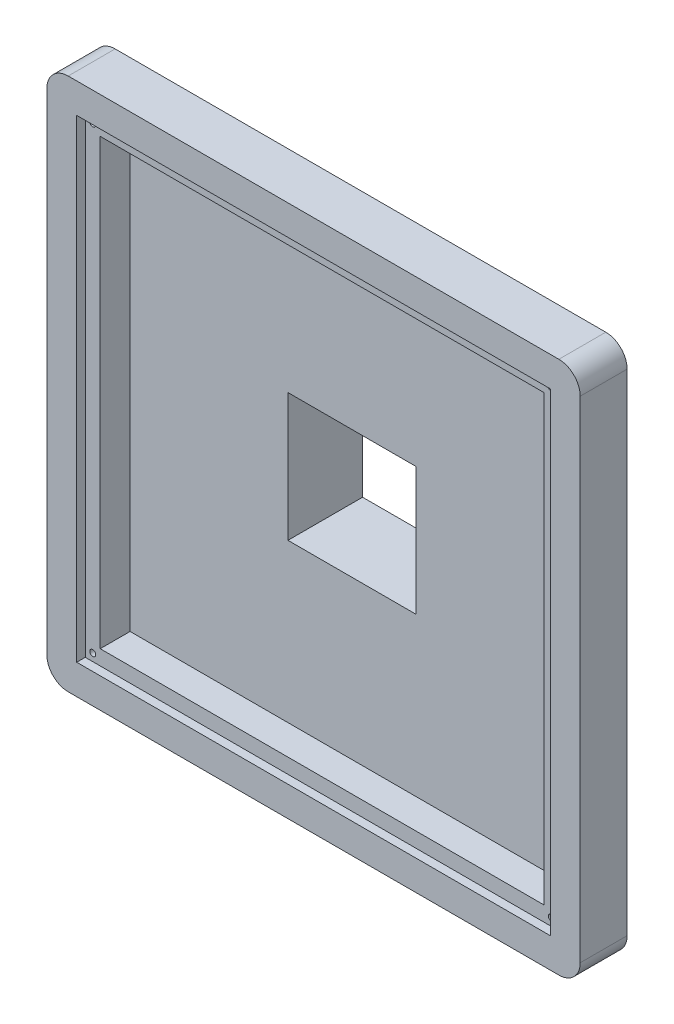
ISO-10303-21;
HEADER;
FILE_DESCRIPTION(('STEP AP214'),'2;1');
FILE_NAME('part.step','',(''),(''),'','','');
FILE_SCHEMA(('AUTOMOTIVE_DESIGN { 1 0 10303 214 1 1 1 1 }'));
ENDSEC;
DATA;
#1=APPLICATION_CONTEXT('core data for automotive mechanical design processes');
#2=APPLICATION_PROTOCOL_DEFINITION('international standard','automotive_design',2000,#1);
#3=PRODUCT_CONTEXT('',#1,'mechanical');
#4=PRODUCT('Part','Part','',(#3));
#5=PRODUCT_RELATED_PRODUCT_CATEGORY('part','',(#4));
#6=PRODUCT_DEFINITION_FORMATION('','',#4);
#7=PRODUCT_DEFINITION_CONTEXT('part definition',#1,'design');
#8=PRODUCT_DEFINITION('design','',#6,#7);
#9=PRODUCT_DEFINITION_SHAPE('','',#8);
#10=(LENGTH_UNIT() NAMED_UNIT(*) SI_UNIT(.MILLI.,.METRE.));
#11=(NAMED_UNIT(*) PLANE_ANGLE_UNIT() SI_UNIT($,.RADIAN.));
#12=(NAMED_UNIT(*) SI_UNIT($,.STERADIAN.) SOLID_ANGLE_UNIT());
#13=UNCERTAINTY_MEASURE_WITH_UNIT(LENGTH_MEASURE(1.E-05),#10,'distance_accuracy_value','');
#14=(GEOMETRIC_REPRESENTATION_CONTEXT(3) GLOBAL_UNCERTAINTY_ASSIGNED_CONTEXT((#13)) GLOBAL_UNIT_ASSIGNED_CONTEXT((#10,
#11,#12)) REPRESENTATION_CONTEXT('',''));
#15=CARTESIAN_POINT('',(0.,0.,0.));
#16=DIRECTION('',(0.,0.,1.));
#17=DIRECTION('',(1.,0.,0.));
#18=AXIS2_PLACEMENT_3D('',#15,#16,#17);
#19=CARTESIAN_POINT('',(0.,0.,21.));
#20=DIRECTION('',(0.,0.,1.));
#21=DIRECTION('',(1.,0.,0.));
#22=AXIS2_PLACEMENT_3D('',#19,#20,#21);
#23=PLANE('',#22);
#24=DIRECTION('',(0.,1.,0.));
#25=VECTOR('',#24,1.);
#26=CARTESIAN_POINT('',(68.2674320619959,-137.574658474626,21.));
#27=LINE('',#26,#25);
#28=CARTESIAN_POINT('',(68.2674320619959,-127.574658474626,21.));
#29=VERTEX_POINT('',#28);
#30=CARTESIAN_POINT('',(68.2674320619959,102.425341525374,21.));
#31=VERTEX_POINT('',#30);
#32=EDGE_CURVE('E350',#29,#31,#27,.T.);
#33=ORIENTED_EDGE('',*,*,#32,.F.);
#34=CARTESIAN_POINT('',(58.2674320619959,-127.574658474626,21.));
#35=DIRECTION('',(0.,0.,1.));
#36=DIRECTION('',(1.,0.,0.));
#37=AXIS2_PLACEMENT_3D('',#34,#35,#36);
#38=CIRCLE('',#37,10.);
#39=CARTESIAN_POINT('',(58.2674320619959,-137.574658474626,21.));
#40=VERTEX_POINT('',#39);
#41=EDGE_CURVE('E396',#29,#40,#38,.F.);
#42=ORIENTED_EDGE('',*,*,#41,.T.);
#43=DIRECTION('',(1.,0.,0.));
#44=VECTOR('',#43,1.);
#45=CARTESIAN_POINT('',(68.2674320619959,-137.574658474626,21.));
#46=LINE('',#45,#44);
#47=CARTESIAN_POINT('',(-171.732567938004,-137.574658474626,21.));
#48=VERTEX_POINT('',#47);
#49=EDGE_CURVE('E347',#48,#40,#46,.T.);
#50=ORIENTED_EDGE('',*,*,#49,.F.);
#51=CARTESIAN_POINT('',(-171.732567938004,-127.574658474626,21.));
#52=DIRECTION('',(0.,0.,1.));
#53=DIRECTION('',(1.,0.,0.));
#54=AXIS2_PLACEMENT_3D('',#51,#52,#53);
#55=CIRCLE('',#54,10.);
#56=CARTESIAN_POINT('',(-181.732567938004,-127.574658474626,21.));
#57=VERTEX_POINT('',#56);
#58=EDGE_CURVE('E376',#48,#57,#55,.F.);
#59=ORIENTED_EDGE('',*,*,#58,.T.);
#60=DIRECTION('',(0.,-1.,0.));
#61=VECTOR('',#60,1.);
#62=CARTESIAN_POINT('',(-181.732567938004,-137.574658474626,21.));
#63=LINE('',#62,#61);
#64=CARTESIAN_POINT('',(-181.732567938004,102.425341525374,21.));
#65=VERTEX_POINT('',#64);
#66=EDGE_CURVE('E344',#65,#57,#63,.T.);
#67=ORIENTED_EDGE('',*,*,#66,.F.);
#68=CARTESIAN_POINT('',(-171.732567938004,102.425341525374,21.));
#69=DIRECTION('',(0.,0.,1.));
#70=DIRECTION('',(1.,0.,0.));
#71=AXIS2_PLACEMENT_3D('',#68,#69,#70);
#72=CIRCLE('',#71,10.);
#73=CARTESIAN_POINT('',(-171.732567938004,112.425341525374,21.));
#74=VERTEX_POINT('',#73);
#75=EDGE_CURVE('E365',#65,#74,#72,.F.);
#76=ORIENTED_EDGE('',*,*,#75,.T.);
#77=DIRECTION('',(-1.,0.,0.));
#78=VECTOR('',#77,1.);
#79=CARTESIAN_POINT('',(68.2674320619959,112.425341525374,21.));
#80=LINE('',#79,#78);
#81=CARTESIAN_POINT('',(58.2674320619959,112.425341525374,21.));
#82=VERTEX_POINT('',#81);
#83=EDGE_CURVE('E352',#82,#74,#80,.T.);
#84=ORIENTED_EDGE('',*,*,#83,.F.);
#85=CARTESIAN_POINT('',(58.2674320619959,102.425341525374,21.));
#86=DIRECTION('',(0.,0.,1.));
#87=DIRECTION('',(1.,0.,0.));
#88=AXIS2_PLACEMENT_3D('',#85,#86,#87);
#89=CIRCLE('',#88,10.);
#90=EDGE_CURVE('E385',#82,#31,#89,.F.);
#91=ORIENTED_EDGE('',*,*,#90,.T.);
#92=EDGE_LOOP('',(#33,#42,#50,#59,#67,#76,#84,#91));
#93=FACE_BOUND('',#92,.T.);
#94=DIRECTION('',(0.,-1.,0.));
#95=VECTOR('',#94,1.);
#96=CARTESIAN_POINT('',(-18.7325679380041,25.425341525374,21.));
#97=LINE('',#96,#95);
#98=CARTESIAN_POINT('',(-18.7325679380041,25.425341525374,21.));
#99=VERTEX_POINT('',#98);
#100=CARTESIAN_POINT('',(-18.7325679380041,-50.574658474626,21.));
#101=VERTEX_POINT('',#100);
#102=EDGE_CURVE('E218',#99,#101,#97,.T.);
#103=ORIENTED_EDGE('',*,*,#102,.F.);
#104=DIRECTION('',(1.,0.,0.));
#105=VECTOR('',#104,1.);
#106=CARTESIAN_POINT('',(-94.7325679380041,25.425341525374,21.));
#107=LINE('',#106,#105);
#108=CARTESIAN_POINT('',(-94.7325679380041,25.425341525374,21.));
#109=VERTEX_POINT('',#108);
#110=EDGE_CURVE('E215',#109,#99,#107,.T.);
#111=ORIENTED_EDGE('',*,*,#110,.F.);
#112=DIRECTION('',(0.,1.,0.));
#113=VECTOR('',#112,1.);
#114=CARTESIAN_POINT('',(-94.7325679380041,25.425341525374,21.));
#115=LINE('',#114,#113);
#116=CARTESIAN_POINT('',(-94.7325679380041,-50.574658474626,21.));
#117=VERTEX_POINT('',#116);
#118=EDGE_CURVE('E58',#117,#109,#115,.T.);
#119=ORIENTED_EDGE('',*,*,#118,.F.);
#120=DIRECTION('',(-1.,0.,0.));
#121=VECTOR('',#120,1.);
#122=CARTESIAN_POINT('',(-94.7325679380041,-50.574658474626,21.));
#123=LINE('',#122,#121);
#124=EDGE_CURVE('E53',#101,#117,#123,.T.);
#125=ORIENTED_EDGE('',*,*,#124,.F.);
#126=EDGE_LOOP('',(#103,#111,#119,#125));
#127=FACE_BOUND('',#126,.T.);
#128=ADVANCED_FACE('F38',(#93,#127),#23,.F.);
#129=CARTESIAN_POINT('',(0.,0.,43.));
#130=DIRECTION('',(0.,0.,1.));
#131=DIRECTION('',(1.,0.,0.));
#132=AXIS2_PLACEMENT_3D('',#129,#130,#131);
#133=PLANE('',#132);
#134=DIRECTION('',(1.,0.,0.));
#135=VECTOR('',#134,1.);
#136=CARTESIAN_POINT('',(68.2674320619959,-137.574658474626,43.));
#137=LINE('',#136,#135);
#138=CARTESIAN_POINT('',(-171.732567938004,-137.574658474626,43.));
#139=VERTEX_POINT('',#138);
#140=CARTESIAN_POINT('',(58.2674320619959,-137.574658474626,43.));
#141=VERTEX_POINT('',#140);
#142=EDGE_CURVE('E325',#139,#141,#137,.T.);
#143=ORIENTED_EDGE('',*,*,#142,.T.);
#144=CARTESIAN_POINT('',(58.2674320619959,-127.574658474626,43.));
#145=DIRECTION('',(0.,0.,1.));
#146=DIRECTION('',(1.,0.,0.));
#147=AXIS2_PLACEMENT_3D('',#144,#145,#146);
#148=CIRCLE('',#147,10.);
#149=CARTESIAN_POINT('',(68.2674320619959,-127.574658474626,43.));
#150=VERTEX_POINT('',#149);
#151=EDGE_CURVE('E11',#141,#150,#148,.T.);
#152=ORIENTED_EDGE('',*,*,#151,.T.);
#153=DIRECTION('',(0.,1.,0.));
#154=VECTOR('',#153,1.);
#155=CARTESIAN_POINT('',(68.2674320619959,-137.574658474626,43.));
#156=LINE('',#155,#154);
#157=CARTESIAN_POINT('',(68.2674320619959,102.425341525374,43.));
#158=VERTEX_POINT('',#157);
#159=EDGE_CURVE('E328',#150,#158,#156,.T.);
#160=ORIENTED_EDGE('',*,*,#159,.T.);
#161=CARTESIAN_POINT('',(58.2674320619959,102.425341525374,43.));
#162=DIRECTION('',(0.,0.,1.));
#163=DIRECTION('',(1.,0.,0.));
#164=AXIS2_PLACEMENT_3D('',#161,#162,#163);
#165=CIRCLE('',#164,10.);
#166=CARTESIAN_POINT('',(58.2674320619959,112.425341525374,43.));
#167=VERTEX_POINT('',#166);
#168=EDGE_CURVE('E391',#158,#167,#165,.T.);
#169=ORIENTED_EDGE('',*,*,#168,.T.);
#170=DIRECTION('',(-1.,0.,0.));
#171=VECTOR('',#170,1.);
#172=CARTESIAN_POINT('',(68.2674320619959,112.425341525374,43.));
#173=LINE('',#172,#171);
#174=CARTESIAN_POINT('',(-171.732567938004,112.425341525374,43.));
#175=VERTEX_POINT('',#174);
#176=EDGE_CURVE('E330',#167,#175,#173,.T.);
#177=ORIENTED_EDGE('',*,*,#176,.T.);
#178=CARTESIAN_POINT('',(-171.732567938004,102.425341525374,43.));
#179=DIRECTION('',(0.,0.,1.));
#180=DIRECTION('',(1.,0.,0.));
#181=AXIS2_PLACEMENT_3D('',#178,#179,#180);
#182=CIRCLE('',#181,10.);
#183=CARTESIAN_POINT('',(-181.732567938004,102.425341525374,43.));
#184=VERTEX_POINT('',#183);
#185=EDGE_CURVE('E371',#175,#184,#182,.T.);
#186=ORIENTED_EDGE('',*,*,#185,.T.);
#187=DIRECTION('',(0.,-1.,0.));
#188=VECTOR('',#187,1.);
#189=CARTESIAN_POINT('',(-181.732567938004,-137.574658474626,43.));
#190=LINE('',#189,#188);
#191=CARTESIAN_POINT('',(-181.732567938004,-127.574658474626,43.));
#192=VERTEX_POINT('',#191);
#193=EDGE_CURVE('E322',#184,#192,#190,.T.);
#194=ORIENTED_EDGE('',*,*,#193,.T.);
#195=CARTESIAN_POINT('',(-171.732567938004,-127.574658474626,43.));
#196=DIRECTION('',(0.,0.,1.));
#197=DIRECTION('',(1.,0.,0.));
#198=AXIS2_PLACEMENT_3D('',#195,#196,#197);
#199=CIRCLE('',#198,10.);
#200=EDGE_CURVE('E380',#192,#139,#199,.T.);
#201=ORIENTED_EDGE('',*,*,#200,.T.);
#202=EDGE_LOOP('',(#143,#152,#160,#169,#177,#186,#194,#201));
#203=FACE_BOUND('',#202,.T.);
#204=DIRECTION('',(0.,1.,0.));
#205=VECTOR('',#204,1.);
#206=CARTESIAN_POINT('',(54.2674320619959,-123.574658474626,43.));
#207=LINE('',#206,#205);
#208=CARTESIAN_POINT('',(54.2674320619959,-123.574658474626,43.));
#209=VERTEX_POINT('',#208);
#210=CARTESIAN_POINT('',(54.2674320619959,98.425341525374,43.));
#211=VERTEX_POINT('',#210);
#212=EDGE_CURVE('E294',#209,#211,#207,.T.);
#213=ORIENTED_EDGE('',*,*,#212,.F.);
#214=DIRECTION('',(-1.,0.,0.));
#215=VECTOR('',#214,1.);
#216=CARTESIAN_POINT('',(54.2674320619959,-123.574658474626,43.));
#217=LINE('',#216,#215);
#218=CARTESIAN_POINT('',(-167.732567938004,-123.574658474626,43.));
#219=VERTEX_POINT('',#218);
#220=EDGE_CURVE('E289',#209,#219,#217,.T.);
#221=ORIENTED_EDGE('',*,*,#220,.T.);
#222=DIRECTION('',(0.,1.,0.));
#223=VECTOR('',#222,1.);
#224=CARTESIAN_POINT('',(-167.732567938004,-123.574658474626,43.));
#225=LINE('',#224,#223);
#226=CARTESIAN_POINT('',(-167.732567938004,98.425341525374,43.));
#227=VERTEX_POINT('',#226);
#228=EDGE_CURVE('E305',#219,#227,#225,.T.);
#229=ORIENTED_EDGE('',*,*,#228,.T.);
#230=DIRECTION('',(-1.,0.,0.));
#231=VECTOR('',#230,1.);
#232=CARTESIAN_POINT('',(54.2674320619959,98.425341525374,43.));
#233=LINE('',#232,#231);
#234=EDGE_CURVE('E308',#211,#227,#233,.T.);
#235=ORIENTED_EDGE('',*,*,#234,.F.);
#236=EDGE_LOOP('',(#213,#221,#229,#235));
#237=FACE_BOUND('',#236,.T.);
#238=ADVANCED_FACE('F406',(#203,#237),#133,.T.);
#239=CARTESIAN_POINT('',(-181.732567938004,-137.574658474626,25.));
#240=DIRECTION('',(1.,0.,0.));
#241=DIRECTION('',(0.,0.,-1.));
#242=AXIS2_PLACEMENT_3D('',#239,#240,#241);
#243=PLANE('',#242);
#244=ORIENTED_EDGE('',*,*,#66,.T.);
#245=DIRECTION('',(0.,0.,-1.));
#246=VECTOR('',#245,1.);
#247=CARTESIAN_POINT('',(-181.732567938004,-127.574658474626,25.));
#248=LINE('',#247,#246);
#249=EDGE_CURVE('E378',#57,#192,#248,.F.);
#250=ORIENTED_EDGE('',*,*,#249,.T.);
#251=ORIENTED_EDGE('',*,*,#193,.F.);
#252=DIRECTION('',(0.,0.,-1.));
#253=VECTOR('',#252,1.);
#254=CARTESIAN_POINT('',(-181.732567938004,102.425341525374,25.));
#255=LINE('',#254,#253);
#256=EDGE_CURVE('E362',#184,#65,#255,.T.);
#257=ORIENTED_EDGE('',*,*,#256,.T.);
#258=EDGE_LOOP('',(#244,#250,#251,#257));
#259=FACE_BOUND('',#258,.T.);
#260=ADVANCED_FACE('F431',(#259),#243,.F.);
#261=CARTESIAN_POINT('',(68.2674320619959,-137.574658474626,25.));
#262=DIRECTION('',(0.,1.,0.));
#263=DIRECTION('',(-1.,0.,0.));
#264=AXIS2_PLACEMENT_3D('',#261,#262,#263);
#265=PLANE('',#264);
#266=ORIENTED_EDGE('',*,*,#49,.T.);
#267=DIRECTION('',(0.,0.,-1.));
#268=VECTOR('',#267,1.);
#269=CARTESIAN_POINT('',(58.2674320619959,-137.574658474626,25.));
#270=LINE('',#269,#268);
#271=EDGE_CURVE('E46',#40,#141,#270,.F.);
#272=ORIENTED_EDGE('',*,*,#271,.T.);
#273=ORIENTED_EDGE('',*,*,#142,.F.);
#274=DIRECTION('',(0.,0.,-1.));
#275=VECTOR('',#274,1.);
#276=CARTESIAN_POINT('',(-171.732567938004,-137.574658474626,25.));
#277=LINE('',#276,#275);
#278=EDGE_CURVE('E373',#139,#48,#277,.T.);
#279=ORIENTED_EDGE('',*,*,#278,.T.);
#280=EDGE_LOOP('',(#266,#272,#273,#279));
#281=FACE_BOUND('',#280,.T.);
#282=ADVANCED_FACE('F400',(#281),#265,.F.);
#283=CARTESIAN_POINT('',(68.2674320619959,-137.574658474626,25.));
#284=DIRECTION('',(-1.,0.,0.));
#285=DIRECTION('',(0.,0.,1.));
#286=AXIS2_PLACEMENT_3D('',#283,#284,#285);
#287=PLANE('',#286);
#288=ORIENTED_EDGE('',*,*,#159,.F.);
#289=DIRECTION('',(0.,0.,-1.));
#290=VECTOR('',#289,1.);
#291=CARTESIAN_POINT('',(68.2674320619959,-127.574658474626,25.));
#292=LINE('',#291,#290);
#293=EDGE_CURVE('E393',#150,#29,#292,.T.);
#294=ORIENTED_EDGE('',*,*,#293,.T.);
#295=ORIENTED_EDGE('',*,*,#32,.T.);
#296=DIRECTION('',(0.,0.,-1.));
#297=VECTOR('',#296,1.);
#298=CARTESIAN_POINT('',(68.2674320619959,102.425341525374,25.));
#299=LINE('',#298,#297);
#300=EDGE_CURVE('E388',#31,#158,#299,.F.);
#301=ORIENTED_EDGE('',*,*,#300,.T.);
#302=EDGE_LOOP('',(#288,#294,#295,#301));
#303=FACE_BOUND('',#302,.T.);
#304=ADVANCED_FACE('F413',(#303),#287,.F.);
#305=CARTESIAN_POINT('',(68.2674320619959,112.425341525374,25.));
#306=DIRECTION('',(0.,-1.,0.));
#307=DIRECTION('',(1.,0.,0.));
#308=AXIS2_PLACEMENT_3D('',#305,#306,#307);
#309=PLANE('',#308);
#310=ORIENTED_EDGE('',*,*,#176,.F.);
#311=DIRECTION('',(0.,0.,-1.));
#312=VECTOR('',#311,1.);
#313=CARTESIAN_POINT('',(58.2674320619959,112.425341525374,25.));
#314=LINE('',#313,#312);
#315=EDGE_CURVE('E382',#167,#82,#314,.T.);
#316=ORIENTED_EDGE('',*,*,#315,.T.);
#317=ORIENTED_EDGE('',*,*,#83,.T.);
#318=DIRECTION('',(0.,0.,-1.));
#319=VECTOR('',#318,1.);
#320=CARTESIAN_POINT('',(-171.732567938004,112.425341525374,25.));
#321=LINE('',#320,#319);
#322=EDGE_CURVE('E368',#74,#175,#321,.F.);
#323=ORIENTED_EDGE('',*,*,#322,.T.);
#324=EDGE_LOOP('',(#310,#316,#317,#323));
#325=FACE_BOUND('',#324,.T.);
#326=ADVANCED_FACE('F423',(#325),#309,.F.);
#327=CARTESIAN_POINT('',(54.2674320619959,-123.574658474626,39.));
#328=DIRECTION('',(0.,1.,0.));
#329=DIRECTION('',(-1.,0.,0.));
#330=AXIS2_PLACEMENT_3D('',#327,#328,#329);
#331=PLANE('',#330);
#332=ORIENTED_EDGE('',*,*,#220,.F.);
#333=DIRECTION('',(0.,0.,1.));
#334=VECTOR('',#333,1.);
#335=CARTESIAN_POINT('',(54.2674320619959,-123.574658474626,39.));
#336=LINE('',#335,#334);
#337=CARTESIAN_POINT('',(54.2674320619959,-123.574658474626,39.));
#338=VERTEX_POINT('',#337);
#339=EDGE_CURVE('E302',#338,#209,#336,.T.);
#340=ORIENTED_EDGE('',*,*,#339,.F.);
#341=DIRECTION('',(-1.,0.,0.));
#342=VECTOR('',#341,1.);
#343=CARTESIAN_POINT('',(54.2674320619959,-123.574658474626,39.));
#344=LINE('',#343,#342);
#345=CARTESIAN_POINT('',(-167.732567938004,-123.574658474626,39.));
#346=VERTEX_POINT('',#345);
#347=EDGE_CURVE('E290',#338,#346,#344,.T.);
#348=ORIENTED_EDGE('',*,*,#347,.T.);
#349=DIRECTION('',(0.,0.,1.));
#350=VECTOR('',#349,1.);
#351=CARTESIAN_POINT('',(-167.732567938004,-123.574658474626,39.));
#352=LINE('',#351,#350);
#353=EDGE_CURVE('E319',#346,#219,#352,.T.);
#354=ORIENTED_EDGE('',*,*,#353,.T.);
#355=EDGE_LOOP('',(#332,#340,#348,#354));
#356=FACE_BOUND('',#355,.T.);
#357=ADVANCED_FACE('F455',(#356),#331,.T.);
#358=CARTESIAN_POINT('',(-167.732567938004,-123.574658474626,39.));
#359=DIRECTION('',(1.,0.,0.));
#360=DIRECTION('',(0.,0.,-1.));
#361=AXIS2_PLACEMENT_3D('',#358,#359,#360);
#362=PLANE('',#361);
#363=ORIENTED_EDGE('',*,*,#228,.F.);
#364=ORIENTED_EDGE('',*,*,#353,.F.);
#365=DIRECTION('',(0.,1.,0.));
#366=VECTOR('',#365,1.);
#367=CARTESIAN_POINT('',(-167.732567938004,-123.574658474626,39.));
#368=LINE('',#367,#366);
#369=CARTESIAN_POINT('',(-167.732567938004,98.425341525374,39.));
#370=VERTEX_POINT('',#369);
#371=EDGE_CURVE('E293',#346,#370,#368,.T.);
#372=ORIENTED_EDGE('',*,*,#371,.T.);
#373=DIRECTION('',(0.,0.,1.));
#374=VECTOR('',#373,1.);
#375=CARTESIAN_POINT('',(-167.732567938004,98.425341525374,39.));
#376=LINE('',#375,#374);
#377=EDGE_CURVE('E317',#370,#227,#376,.T.);
#378=ORIENTED_EDGE('',*,*,#377,.T.);
#379=EDGE_LOOP('',(#363,#364,#372,#378));
#380=FACE_BOUND('',#379,.T.);
#381=ADVANCED_FACE('F542',(#380),#362,.T.);
#382=CARTESIAN_POINT('',(54.2674320619959,98.425341525374,39.));
#383=DIRECTION('',(0.,1.,0.));
#384=DIRECTION('',(-1.,0.,0.));
#385=AXIS2_PLACEMENT_3D('',#382,#383,#384);
#386=PLANE('',#385);
#387=ORIENTED_EDGE('',*,*,#234,.T.);
#388=ORIENTED_EDGE('',*,*,#377,.F.);
#389=DIRECTION('',(-1.,0.,0.));
#390=VECTOR('',#389,1.);
#391=CARTESIAN_POINT('',(54.2674320619959,98.425341525374,39.));
#392=LINE('',#391,#390);
#393=CARTESIAN_POINT('',(54.2674320619959,98.425341525374,39.));
#394=VERTEX_POINT('',#393);
#395=EDGE_CURVE('E296',#394,#370,#392,.T.);
#396=ORIENTED_EDGE('',*,*,#395,.F.);
#397=DIRECTION('',(0.,0.,1.));
#398=VECTOR('',#397,1.);
#399=CARTESIAN_POINT('',(54.2674320619959,98.425341525374,39.));
#400=LINE('',#399,#398);
#401=EDGE_CURVE('E315',#394,#211,#400,.T.);
#402=ORIENTED_EDGE('',*,*,#401,.T.);
#403=EDGE_LOOP('',(#387,#388,#396,#402));
#404=FACE_BOUND('',#403,.T.);
#405=ADVANCED_FACE('F538',(#404),#386,.F.);
#406=CARTESIAN_POINT('',(54.2674320619959,-123.574658474626,39.));
#407=DIRECTION('',(1.,0.,0.));
#408=DIRECTION('',(0.,0.,-1.));
#409=AXIS2_PLACEMENT_3D('',#406,#407,#408);
#410=PLANE('',#409);
#411=ORIENTED_EDGE('',*,*,#212,.T.);
#412=ORIENTED_EDGE('',*,*,#401,.F.);
#413=DIRECTION('',(0.,1.,0.));
#414=VECTOR('',#413,1.);
#415=CARTESIAN_POINT('',(54.2674320619959,-123.574658474626,39.));
#416=LINE('',#415,#414);
#417=EDGE_CURVE('E299',#338,#394,#416,.T.);
#418=ORIENTED_EDGE('',*,*,#417,.F.);
#419=ORIENTED_EDGE('',*,*,#339,.T.);
#420=EDGE_LOOP('',(#411,#412,#418,#419));
#421=FACE_BOUND('',#420,.T.);
#422=ADVANCED_FACE('F534',(#421),#410,.F.);
#423=CARTESIAN_POINT('',(0.,0.,39.));
#424=DIRECTION('',(0.,0.,-1.));
#425=DIRECTION('',(-1.,0.,0.));
#426=AXIS2_PLACEMENT_3D('',#423,#424,#425);
#427=PLANE('',#426);
#428=CARTESIAN_POINT('',(50.7674320619959,94.925341525374,39.));
#429=DIRECTION('',(0.,0.,-1.));
#430=DIRECTION('',(1.,0.,0.));
#431=AXIS2_PLACEMENT_3D('',#428,#429,#430);
#432=CIRCLE('',#431,1.4);
#433=CARTESIAN_POINT('',(52.1674320619959,94.925341525374,39.));
#434=VERTEX_POINT('',#433);
#435=EDGE_CURVE('E236',#434,#434,#432,.T.);
#436=ORIENTED_EDGE('',*,*,#435,.T.);
#437=EDGE_LOOP('',(#436));
#438=FACE_BOUND('',#437,.T.);
#439=CARTESIAN_POINT('',(-164.232567938004,94.9253415253739,39.));
#440=DIRECTION('',(0.,0.,1.));
#441=DIRECTION('',(-1.,0.,0.));
#442=AXIS2_PLACEMENT_3D('',#439,#440,#441);
#443=CIRCLE('',#442,1.4);
#444=CARTESIAN_POINT('',(-165.632567938004,94.9253415253739,39.));
#445=VERTEX_POINT('',#444);
#446=EDGE_CURVE('E240',#445,#445,#443,.T.);
#447=ORIENTED_EDGE('',*,*,#446,.F.);
#448=EDGE_LOOP('',(#447));
#449=FACE_BOUND('',#448,.T.);
#450=CARTESIAN_POINT('',(-164.232567938004,-120.074658474626,39.));
#451=DIRECTION('',(0.,0.,-1.));
#452=DIRECTION('',(-1.,0.,0.));
#453=AXIS2_PLACEMENT_3D('',#450,#451,#452);
#454=CIRCLE('',#453,1.4);
#455=CARTESIAN_POINT('',(-165.632567938004,-120.074658474626,39.));
#456=VERTEX_POINT('',#455);
#457=EDGE_CURVE('E246',#456,#456,#454,.T.);
#458=ORIENTED_EDGE('',*,*,#457,.T.);
#459=EDGE_LOOP('',(#458));
#460=FACE_BOUND('',#459,.T.);
#461=CARTESIAN_POINT('',(50.7674320619959,-120.074658474626,39.));
#462=DIRECTION('',(0.,0.,1.));
#463=DIRECTION('',(1.,0.,0.));
#464=AXIS2_PLACEMENT_3D('',#461,#462,#463);
#465=CIRCLE('',#464,1.4);
#466=CARTESIAN_POINT('',(52.1674320619959,-120.074658474626,39.));
#467=VERTEX_POINT('',#466);
#468=EDGE_CURVE('E252',#467,#467,#465,.T.);
#469=ORIENTED_EDGE('',*,*,#468,.F.);
#470=EDGE_LOOP('',(#469));
#471=FACE_BOUND('',#470,.T.);
#472=ORIENTED_EDGE('',*,*,#347,.F.);
#473=ORIENTED_EDGE('',*,*,#417,.T.);
#474=ORIENTED_EDGE('',*,*,#395,.T.);
#475=ORIENTED_EDGE('',*,*,#371,.F.);
#476=EDGE_LOOP('',(#472,#473,#474,#475));
#477=FACE_BOUND('',#476,.T.);
#478=DIRECTION('',(1.,0.,0.));
#479=VECTOR('',#478,1.);
#480=CARTESIAN_POINT('',(47.2674320619959,-116.574658474626,39.));
#481=LINE('',#480,#479);
#482=CARTESIAN_POINT('',(-160.732567938004,-116.574658474626,39.));
#483=VERTEX_POINT('',#482);
#484=CARTESIAN_POINT('',(47.2674320619959,-116.574658474626,39.));
#485=VERTEX_POINT('',#484);
#486=EDGE_CURVE('E263',#483,#485,#481,.T.);
#487=ORIENTED_EDGE('',*,*,#486,.F.);
#488=DIRECTION('',(0.,-1.,0.));
#489=VECTOR('',#488,1.);
#490=CARTESIAN_POINT('',(-160.732567938004,-116.574658474626,39.));
#491=LINE('',#490,#489);
#492=CARTESIAN_POINT('',(-160.732567938004,91.4253415253739,39.));
#493=VERTEX_POINT('',#492);
#494=EDGE_CURVE('E261',#493,#483,#491,.T.);
#495=ORIENTED_EDGE('',*,*,#494,.F.);
#496=DIRECTION('',(-1.,0.,0.));
#497=VECTOR('',#496,1.);
#498=CARTESIAN_POINT('',(47.2674320619959,91.4253415253739,39.));
#499=LINE('',#498,#497);
#500=CARTESIAN_POINT('',(47.2674320619959,91.4253415253739,39.));
#501=VERTEX_POINT('',#500);
#502=EDGE_CURVE('E269',#501,#493,#499,.T.);
#503=ORIENTED_EDGE('',*,*,#502,.F.);
#504=DIRECTION('',(0.,1.,0.));
#505=VECTOR('',#504,1.);
#506=CARTESIAN_POINT('',(47.2674320619959,-116.574658474626,39.));
#507=LINE('',#506,#505);
#508=EDGE_CURVE('E266',#485,#501,#507,.T.);
#509=ORIENTED_EDGE('',*,*,#508,.F.);
#510=EDGE_LOOP('',(#487,#495,#503,#509));
#511=FACE_BOUND('',#510,.T.);
#512=ADVANCED_FACE('F509',(#438,#449,#460,#471,#477,#511),#427,.F.);
#513=CARTESIAN_POINT('',(-160.732567938004,-116.574658474626,39.));
#514=DIRECTION('',(1.,0.,0.));
#515=DIRECTION('',(0.,1.,0.));
#516=AXIS2_PLACEMENT_3D('',#513,#514,#515);
#517=PLANE('',#516);
#518=DIRECTION('',(0.,-1.,0.));
#519=VECTOR('',#518,1.);
#520=CARTESIAN_POINT('',(-160.732567938004,-116.574658474626,25.));
#521=LINE('',#520,#519);
#522=CARTESIAN_POINT('',(-160.732567938004,91.4253415253739,25.));
#523=VERTEX_POINT('',#522);
#524=CARTESIAN_POINT('',(-160.732567938004,-116.574658474626,25.));
#525=VERTEX_POINT('',#524);
#526=EDGE_CURVE('E258',#523,#525,#521,.T.);
#527=ORIENTED_EDGE('',*,*,#526,.F.);
#528=DIRECTION('',(0.,0.,-1.));
#529=VECTOR('',#528,1.);
#530=CARTESIAN_POINT('',(-160.732567938004,91.4253415253739,39.));
#531=LINE('',#530,#529);
#532=EDGE_CURVE('E271',#493,#523,#531,.T.);
#533=ORIENTED_EDGE('',*,*,#532,.F.);
#534=ORIENTED_EDGE('',*,*,#494,.T.);
#535=DIRECTION('',(0.,0.,-1.));
#536=VECTOR('',#535,1.);
#537=CARTESIAN_POINT('',(-160.732567938004,-116.574658474626,39.));
#538=LINE('',#537,#536);
#539=EDGE_CURVE('E286',#483,#525,#538,.T.);
#540=ORIENTED_EDGE('',*,*,#539,.T.);
#541=EDGE_LOOP('',(#527,#533,#534,#540));
#542=FACE_BOUND('',#541,.T.);
#543=ADVANCED_FACE('F505',(#542),#517,.T.);
#544=CARTESIAN_POINT('',(47.2674320619959,-116.574658474626,39.));
#545=DIRECTION('',(0.,1.,0.));
#546=DIRECTION('',(-1.,0.,0.));
#547=AXIS2_PLACEMENT_3D('',#544,#545,#546);
#548=PLANE('',#547);
#549=DIRECTION('',(1.,0.,0.));
#550=VECTOR('',#549,1.);
#551=CARTESIAN_POINT('',(47.2674320619959,-116.574658474626,25.));
#552=LINE('',#551,#550);
#553=CARTESIAN_POINT('',(47.2674320619959,-116.574658474626,25.));
#554=VERTEX_POINT('',#553);
#555=EDGE_CURVE('E273',#525,#554,#552,.T.);
#556=ORIENTED_EDGE('',*,*,#555,.F.);
#557=ORIENTED_EDGE('',*,*,#539,.F.);
#558=ORIENTED_EDGE('',*,*,#486,.T.);
#559=DIRECTION('',(0.,0.,-1.));
#560=VECTOR('',#559,1.);
#561=CARTESIAN_POINT('',(47.2674320619959,-116.574658474626,39.));
#562=LINE('',#561,#560);
#563=EDGE_CURVE('E283',#485,#554,#562,.T.);
#564=ORIENTED_EDGE('',*,*,#563,.T.);
#565=EDGE_LOOP('',(#556,#557,#558,#564));
#566=FACE_BOUND('',#565,.T.);
#567=ADVANCED_FACE('F501',(#566),#548,.T.);
#568=CARTESIAN_POINT('',(47.2674320619959,-116.574658474626,39.));
#569=DIRECTION('',(-1.,0.,0.));
#570=DIRECTION('',(0.,0.,1.));
#571=AXIS2_PLACEMENT_3D('',#568,#569,#570);
#572=PLANE('',#571);
#573=DIRECTION('',(0.,1.,0.));
#574=VECTOR('',#573,1.);
#575=CARTESIAN_POINT('',(47.2674320619959,-116.574658474626,25.));
#576=LINE('',#575,#574);
#577=CARTESIAN_POINT('',(47.2674320619959,91.4253415253739,25.));
#578=VERTEX_POINT('',#577);
#579=EDGE_CURVE('E275',#554,#578,#576,.T.);
#580=ORIENTED_EDGE('',*,*,#579,.F.);
#581=ORIENTED_EDGE('',*,*,#563,.F.);
#582=ORIENTED_EDGE('',*,*,#508,.T.);
#583=DIRECTION('',(0.,0.,-1.));
#584=VECTOR('',#583,1.);
#585=CARTESIAN_POINT('',(47.2674320619959,91.4253415253739,39.));
#586=LINE('',#585,#584);
#587=EDGE_CURVE('E280',#501,#578,#586,.T.);
#588=ORIENTED_EDGE('',*,*,#587,.T.);
#589=EDGE_LOOP('',(#580,#581,#582,#588));
#590=FACE_BOUND('',#589,.T.);
#591=ADVANCED_FACE('F512',(#590),#572,.T.);
#592=CARTESIAN_POINT('',(47.2674320619959,91.4253415253739,39.));
#593=DIRECTION('',(0.,-1.,0.));
#594=DIRECTION('',(1.,0.,0.));
#595=AXIS2_PLACEMENT_3D('',#592,#593,#594);
#596=PLANE('',#595);
#597=DIRECTION('',(-1.,0.,0.));
#598=VECTOR('',#597,1.);
#599=CARTESIAN_POINT('',(47.2674320619959,91.4253415253739,25.));
#600=LINE('',#599,#598);
#601=EDGE_CURVE('E264',#578,#523,#600,.T.);
#602=ORIENTED_EDGE('',*,*,#601,.F.);
#603=ORIENTED_EDGE('',*,*,#587,.F.);
#604=ORIENTED_EDGE('',*,*,#502,.T.);
#605=ORIENTED_EDGE('',*,*,#532,.T.);
#606=EDGE_LOOP('',(#602,#603,#604,#605));
#607=FACE_BOUND('',#606,.T.);
#608=ADVANCED_FACE('F514',(#607),#596,.T.);
#609=CARTESIAN_POINT('',(50.7674320619959,-120.074658474626,29.));
#610=DIRECTION('',(0.,0.,1.));
#611=DIRECTION('',(1.,0.,0.));
#612=AXIS2_PLACEMENT_3D('',#609,#610,#611);
#613=CYLINDRICAL_SURFACE('',#612,1.4);
#614=CARTESIAN_POINT('',(50.7674320619959,-120.074658474626,29.));
#615=DIRECTION('',(0.,0.,1.));
#616=DIRECTION('',(1.,0.,0.));
#617=AXIS2_PLACEMENT_3D('',#614,#615,#616);
#618=CIRCLE('',#617,1.4);
#619=CARTESIAN_POINT('',(52.1674320619959,-120.074658474626,29.));
#620=VERTEX_POINT('',#619);
#621=EDGE_CURVE('E255',#620,#620,#618,.T.);
#622=ORIENTED_EDGE('',*,*,#621,.F.);
#623=EDGE_LOOP('',(#622));
#624=FACE_BOUND('',#623,.T.);
#625=ORIENTED_EDGE('',*,*,#468,.T.);
#626=EDGE_LOOP('',(#625));
#627=FACE_BOUND('',#626,.T.);
#628=ADVANCED_FACE('F516',(#624,#627),#613,.F.);
#629=CARTESIAN_POINT('',(50.7674320619959,-120.074658474626,29.));
#630=DIRECTION('',(0.,0.,1.));
#631=DIRECTION('',(1.,0.,0.));
#632=AXIS2_PLACEMENT_3D('',#629,#630,#631);
#633=PLANE('',#632);
#634=ORIENTED_EDGE('',*,*,#621,.T.);
#635=EDGE_LOOP('',(#634));
#636=FACE_BOUND('',#635,.T.);
#637=ADVANCED_FACE('F522',(#636),#633,.T.);
#638=CARTESIAN_POINT('',(-164.232567938004,-120.074658474626,29.));
#639=DIRECTION('',(0.,0.,1.));
#640=DIRECTION('',(1.,0.,0.));
#641=AXIS2_PLACEMENT_3D('',#638,#639,#640);
#642=CYLINDRICAL_SURFACE('',#641,1.4);
#643=CARTESIAN_POINT('',(-164.232567938004,-120.074658474626,29.));
#644=DIRECTION('',(0.,0.,-1.));
#645=DIRECTION('',(-1.,0.,0.));
#646=AXIS2_PLACEMENT_3D('',#643,#644,#645);
#647=CIRCLE('',#646,1.4);
#648=CARTESIAN_POINT('',(-165.632567938004,-120.074658474626,29.));
#649=VERTEX_POINT('',#648);
#650=EDGE_CURVE('E249',#649,#649,#647,.T.);
#651=ORIENTED_EDGE('',*,*,#650,.T.);
#652=EDGE_LOOP('',(#651));
#653=FACE_BOUND('',#652,.T.);
#654=ORIENTED_EDGE('',*,*,#457,.F.);
#655=EDGE_LOOP('',(#654));
#656=FACE_BOUND('',#655,.T.);
#657=ADVANCED_FACE('F610',(#653,#656),#642,.F.);
#658=CARTESIAN_POINT('',(-164.232567938004,-120.074658474626,29.));
#659=DIRECTION('',(0.,0.,1.));
#660=DIRECTION('',(-1.,0.,0.));
#661=AXIS2_PLACEMENT_3D('',#658,#659,#660);
#662=PLANE('',#661);
#663=ORIENTED_EDGE('',*,*,#650,.F.);
#664=EDGE_LOOP('',(#663));
#665=FACE_BOUND('',#664,.T.);
#666=ADVANCED_FACE('F618',(#665),#662,.T.);
#667=CARTESIAN_POINT('',(-164.232567938004,94.9253415253739,29.));
#668=DIRECTION('',(0.,0.,1.));
#669=DIRECTION('',(1.,0.,0.));
#670=AXIS2_PLACEMENT_3D('',#667,#668,#669);
#671=CYLINDRICAL_SURFACE('',#670,1.4);
#672=CARTESIAN_POINT('',(-164.232567938004,94.9253415253739,29.));
#673=DIRECTION('',(0.,0.,1.));
#674=DIRECTION('',(-1.,0.,0.));
#675=AXIS2_PLACEMENT_3D('',#672,#673,#674);
#676=CIRCLE('',#675,1.4);
#677=CARTESIAN_POINT('',(-165.632567938004,94.9253415253739,29.));
#678=VERTEX_POINT('',#677);
#679=EDGE_CURVE('E243',#678,#678,#676,.T.);
#680=ORIENTED_EDGE('',*,*,#679,.F.);
#681=EDGE_LOOP('',(#680));
#682=FACE_BOUND('',#681,.T.);
#683=ORIENTED_EDGE('',*,*,#446,.T.);
#684=EDGE_LOOP('',(#683));
#685=FACE_BOUND('',#684,.T.);
#686=ADVANCED_FACE('F627',(#682,#685),#671,.F.);
#687=CARTESIAN_POINT('',(-164.232567938004,94.9253415253739,29.));
#688=DIRECTION('',(0.,0.,1.));
#689=DIRECTION('',(-1.,0.,0.));
#690=AXIS2_PLACEMENT_3D('',#687,#688,#689);
#691=PLANE('',#690);
#692=ORIENTED_EDGE('',*,*,#679,.T.);
#693=EDGE_LOOP('',(#692));
#694=FACE_BOUND('',#693,.T.);
#695=ADVANCED_FACE('F637',(#694),#691,.T.);
#696=CARTESIAN_POINT('',(50.7674320619959,94.925341525374,29.));
#697=DIRECTION('',(0.,0.,1.));
#698=DIRECTION('',(1.,0.,0.));
#699=AXIS2_PLACEMENT_3D('',#696,#697,#698);
#700=CYLINDRICAL_SURFACE('',#699,1.4);
#701=CARTESIAN_POINT('',(50.7674320619959,94.925341525374,29.));
#702=DIRECTION('',(0.,0.,-1.));
#703=DIRECTION('',(1.,0.,0.));
#704=AXIS2_PLACEMENT_3D('',#701,#702,#703);
#705=CIRCLE('',#704,1.4);
#706=CARTESIAN_POINT('',(52.1674320619959,94.925341525374,29.));
#707=VERTEX_POINT('',#706);
#708=EDGE_CURVE('E237',#707,#707,#705,.T.);
#709=ORIENTED_EDGE('',*,*,#708,.T.);
#710=EDGE_LOOP('',(#709));
#711=FACE_BOUND('',#710,.T.);
#712=ORIENTED_EDGE('',*,*,#435,.F.);
#713=EDGE_LOOP('',(#712));
#714=FACE_BOUND('',#713,.T.);
#715=ADVANCED_FACE('F644',(#711,#714),#700,.F.);
#716=CARTESIAN_POINT('',(50.7674320619959,94.925341525374,29.));
#717=DIRECTION('',(0.,0.,1.));
#718=DIRECTION('',(1.,0.,0.));
#719=AXIS2_PLACEMENT_3D('',#716,#717,#718);
#720=PLANE('',#719);
#721=ORIENTED_EDGE('',*,*,#708,.F.);
#722=EDGE_LOOP('',(#721));
#723=FACE_BOUND('',#722,.T.);
#724=ADVANCED_FACE('F442',(#723),#720,.T.);
#725=CARTESIAN_POINT('',(-171.732567938004,102.425341525374,25.));
#726=DIRECTION('',(0.,0.,-1.));
#727=DIRECTION('',(-1.,0.,0.));
#728=AXIS2_PLACEMENT_3D('',#725,#726,#727);
#729=CYLINDRICAL_SURFACE('',#728,10.);
#730=ORIENTED_EDGE('',*,*,#185,.F.);
#731=ORIENTED_EDGE('',*,*,#322,.F.);
#732=ORIENTED_EDGE('',*,*,#75,.F.);
#733=ORIENTED_EDGE('',*,*,#256,.F.);
#734=EDGE_LOOP('',(#730,#731,#732,#733));
#735=FACE_BOUND('',#734,.T.);
#736=ADVANCED_FACE('F428',(#735),#729,.T.);
#737=CARTESIAN_POINT('',(-171.732567938004,-127.574658474626,25.));
#738=DIRECTION('',(0.,0.,-1.));
#739=DIRECTION('',(-1.,0.,0.));
#740=AXIS2_PLACEMENT_3D('',#737,#738,#739);
#741=CYLINDRICAL_SURFACE('',#740,10.);
#742=ORIENTED_EDGE('',*,*,#200,.F.);
#743=ORIENTED_EDGE('',*,*,#249,.F.);
#744=ORIENTED_EDGE('',*,*,#58,.F.);
#745=ORIENTED_EDGE('',*,*,#278,.F.);
#746=EDGE_LOOP('',(#742,#743,#744,#745));
#747=FACE_BOUND('',#746,.T.);
#748=ADVANCED_FACE('F435',(#747),#741,.T.);
#749=CARTESIAN_POINT('',(58.2674320619959,102.425341525374,25.));
#750=DIRECTION('',(0.,0.,-1.));
#751=DIRECTION('',(-1.,0.,0.));
#752=AXIS2_PLACEMENT_3D('',#749,#750,#751);
#753=CYLINDRICAL_SURFACE('',#752,10.);
#754=ORIENTED_EDGE('',*,*,#168,.F.);
#755=ORIENTED_EDGE('',*,*,#300,.F.);
#756=ORIENTED_EDGE('',*,*,#90,.F.);
#757=ORIENTED_EDGE('',*,*,#315,.F.);
#758=EDGE_LOOP('',(#754,#755,#756,#757));
#759=FACE_BOUND('',#758,.T.);
#760=ADVANCED_FACE('F420',(#759),#753,.T.);
#761=CARTESIAN_POINT('',(58.2674320619959,-127.574658474626,25.));
#762=DIRECTION('',(0.,0.,-1.));
#763=DIRECTION('',(-1.,0.,0.));
#764=AXIS2_PLACEMENT_3D('',#761,#762,#763);
#765=CYLINDRICAL_SURFACE('',#764,10.);
#766=ORIENTED_EDGE('',*,*,#151,.F.);
#767=ORIENTED_EDGE('',*,*,#271,.F.);
#768=ORIENTED_EDGE('',*,*,#41,.F.);
#769=ORIENTED_EDGE('',*,*,#293,.F.);
#770=EDGE_LOOP('',(#766,#767,#768,#769));
#771=FACE_BOUND('',#770,.T.);
#772=ADVANCED_FACE('F40',(#771),#765,.T.);
#773=CARTESIAN_POINT('',(0.,0.,-10.));
#774=DIRECTION('',(0.,0.,-1.));
#775=DIRECTION('',(-1.,0.,0.));
#776=AXIS2_PLACEMENT_3D('',#773,#774,#775);
#777=PLANE('',#776);
#778=CARTESIAN_POINT('',(-23.2325679380041,-46.074658474626,-10.));
#779=DIRECTION('',(0.,0.,-1.));
#780=DIRECTION('',(1.,0.,0.));
#781=AXIS2_PLACEMENT_3D('',#778,#779,#780);
#782=CIRCLE('',#781,1.4);
#783=CARTESIAN_POINT('',(-21.8325679380041,-46.074658474626,-10.));
#784=VERTEX_POINT('',#783);
#785=EDGE_CURVE('E882',#784,#784,#782,.T.);
#786=ORIENTED_EDGE('',*,*,#785,.F.);
#787=EDGE_LOOP('',(#786));
#788=FACE_BOUND('',#787,.T.);
#789=CARTESIAN_POINT('',(-23.2325679380041,20.925341525374,-10.));
#790=DIRECTION('',(0.,0.,1.));
#791=DIRECTION('',(1.,0.,0.));
#792=AXIS2_PLACEMENT_3D('',#789,#790,#791);
#793=CIRCLE('',#792,1.4);
#794=CARTESIAN_POINT('',(-21.8325679380041,20.925341525374,-10.));
#795=VERTEX_POINT('',#794);
#796=EDGE_CURVE('E881',#795,#795,#793,.T.);
#797=ORIENTED_EDGE('',*,*,#796,.T.);
#798=EDGE_LOOP('',(#797));
#799=FACE_BOUND('',#798,.T.);
#800=CARTESIAN_POINT('',(-90.2325679380041,-46.074658474626,-10.));
#801=DIRECTION('',(0.,0.,1.));
#802=DIRECTION('',(-1.,0.,0.));
#803=AXIS2_PLACEMENT_3D('',#800,#801,#802);
#804=CIRCLE('',#803,1.4);
#805=CARTESIAN_POINT('',(-91.6325679380041,-46.074658474626,-10.));
#806=VERTEX_POINT('',#805);
#807=EDGE_CURVE('E891',#806,#806,#804,.T.);
#808=ORIENTED_EDGE('',*,*,#807,.T.);
#809=EDGE_LOOP('',(#808));
#810=FACE_BOUND('',#809,.T.);
#811=CARTESIAN_POINT('',(-90.2325679380041,20.925341525374,-10.));
#812=DIRECTION('',(0.,0.,-1.));
#813=DIRECTION('',(-1.,0.,0.));
#814=AXIS2_PLACEMENT_3D('',#811,#812,#813);
#815=CIRCLE('',#814,1.4);
#816=CARTESIAN_POINT('',(-91.6325679380041,20.925341525374,-10.));
#817=VERTEX_POINT('',#816);
#818=EDGE_CURVE('E896',#817,#817,#815,.T.);
#819=ORIENTED_EDGE('',*,*,#818,.F.);
#820=EDGE_LOOP('',(#819));
#821=FACE_BOUND('',#820,.T.);
#822=DIRECTION('',(0.,-1.,0.));
#823=VECTOR('',#822,1.);
#824=CARTESIAN_POINT('',(-86.7325679380042,-42.5746584746261,-10.));
#825=LINE('',#824,#823);
#826=CARTESIAN_POINT('',(-86.7325679380042,17.4253415253739,-10.));
#827=VERTEX_POINT('',#826);
#828=CARTESIAN_POINT('',(-86.7325679380042,-42.5746584746261,-10.));
#829=VERTEX_POINT('',#828);
#830=EDGE_CURVE('E219',#827,#829,#825,.T.);
#831=ORIENTED_EDGE('',*,*,#830,.T.);
#832=DIRECTION('',(1.,0.,0.));
#833=VECTOR('',#832,1.);
#834=CARTESIAN_POINT('',(-86.7325679380042,-42.5746584746261,-10.));
#835=LINE('',#834,#833);
#836=CARTESIAN_POINT('',(-26.7325679380042,-42.5746584746261,-10.));
#837=VERTEX_POINT('',#836);
#838=EDGE_CURVE('E222',#829,#837,#835,.T.);
#839=ORIENTED_EDGE('',*,*,#838,.T.);
#840=DIRECTION('',(0.,1.,0.));
#841=VECTOR('',#840,1.);
#842=CARTESIAN_POINT('',(-26.7325679380042,-42.5746584746261,-10.));
#843=LINE('',#842,#841);
#844=CARTESIAN_POINT('',(-26.7325679380042,17.4253415253739,-10.));
#845=VERTEX_POINT('',#844);
#846=EDGE_CURVE('E230',#837,#845,#843,.T.);
#847=ORIENTED_EDGE('',*,*,#846,.T.);
#848=DIRECTION('',(-1.,0.,0.));
#849=VECTOR('',#848,1.);
#850=CARTESIAN_POINT('',(-86.7325679380042,17.4253415253739,-10.));
#851=LINE('',#850,#849);
#852=EDGE_CURVE('E233',#845,#827,#851,.T.);
#853=ORIENTED_EDGE('',*,*,#852,.T.);
#854=EDGE_LOOP('',(#831,#839,#847,#853));
#855=FACE_BOUND('',#854,.T.);
#856=DIRECTION('',(0.,-1.,0.));
#857=VECTOR('',#856,1.);
#858=CARTESIAN_POINT('',(-18.7325679380041,25.425341525374,-10.));
#859=LINE('',#858,#857);
#860=CARTESIAN_POINT('',(-18.7325679380041,25.425341525374,-10.));
#861=VERTEX_POINT('',#860);
#862=CARTESIAN_POINT('',(-18.7325679380041,-50.574658474626,-10.));
#863=VERTEX_POINT('',#862);
#864=EDGE_CURVE('E206',#861,#863,#859,.T.);
#865=ORIENTED_EDGE('',*,*,#864,.T.);
#866=DIRECTION('',(-1.,0.,0.));
#867=VECTOR('',#866,1.);
#868=CARTESIAN_POINT('',(-94.7325679380041,-50.574658474626,-10.));
#869=LINE('',#868,#867);
#870=CARTESIAN_POINT('',(-94.7325679380041,-50.574658474626,-10.));
#871=VERTEX_POINT('',#870);
#872=EDGE_CURVE('E195',#863,#871,#869,.T.);
#873=ORIENTED_EDGE('',*,*,#872,.T.);
#874=DIRECTION('',(0.,1.,0.));
#875=VECTOR('',#874,1.);
#876=CARTESIAN_POINT('',(-94.7325679380041,25.425341525374,-10.));
#877=LINE('',#876,#875);
#878=CARTESIAN_POINT('',(-94.7325679380041,25.425341525374,-10.));
#879=VERTEX_POINT('',#878);
#880=EDGE_CURVE('E205',#871,#879,#877,.T.);
#881=ORIENTED_EDGE('',*,*,#880,.T.);
#882=DIRECTION('',(1.,0.,0.));
#883=VECTOR('',#882,1.);
#884=CARTESIAN_POINT('',(-94.7325679380041,25.425341525374,-10.));
#885=LINE('',#884,#883);
#886=EDGE_CURVE('E211',#879,#861,#885,.T.);
#887=ORIENTED_EDGE('',*,*,#886,.T.);
#888=EDGE_LOOP('',(#865,#873,#881,#887));
#889=FACE_BOUND('',#888,.T.);
#890=ADVANCED_FACE('F209',(#788,#799,#810,#821,#855,#889),#777,.T.);
#891=CARTESIAN_POINT('',(-26.7325679380042,17.4253415253739,21.));
#892=DIRECTION('',(-1.,0.,0.));
#893=DIRECTION('',(0.,-1.,0.));
#894=AXIS2_PLACEMENT_3D('',#891,#892,#893);
#895=PLANE('',#894);
#896=DIRECTION('',(0.,0.,-1.));
#897=VECTOR('',#896,1.);
#898=CARTESIAN_POINT('',(-26.7325679380042,17.4253415253739,21.));
#899=LINE('',#898,#897);
#900=CARTESIAN_POINT('',(-26.7325679380042,17.4253415253739,25.));
#901=VERTEX_POINT('',#900);
#902=EDGE_CURVE('E360',#901,#845,#899,.T.);
#903=ORIENTED_EDGE('',*,*,#902,.T.);
#904=ORIENTED_EDGE('',*,*,#846,.F.);
#905=DIRECTION('',(0.,0.,-1.));
#906=VECTOR('',#905,1.);
#907=CARTESIAN_POINT('',(-26.7325679380042,-42.5746584746261,21.));
#908=LINE('',#907,#906);
#909=CARTESIAN_POINT('',(-26.7325679380042,-42.574658474626,25.));
#910=VERTEX_POINT('',#909);
#911=EDGE_CURVE('E354',#910,#837,#908,.T.);
#912=ORIENTED_EDGE('',*,*,#911,.F.);
#913=DIRECTION('',(0.,1.,0.));
#914=VECTOR('',#913,1.);
#915=CARTESIAN_POINT('',(-26.7325679380042,-42.574658474626,25.));
#916=LINE('',#915,#914);
#917=EDGE_CURVE('E338',#910,#901,#916,.T.);
#918=ORIENTED_EDGE('',*,*,#917,.T.);
#919=EDGE_LOOP('',(#903,#904,#912,#918));
#920=FACE_BOUND('',#919,.T.);
#921=ADVANCED_FACE('F473',(#920),#895,.T.);
#922=CARTESIAN_POINT('',(-86.7325679380042,17.4253415253739,21.));
#923=DIRECTION('',(0.,-1.,0.));
#924=DIRECTION('',(0.,0.,-1.));
#925=AXIS2_PLACEMENT_3D('',#922,#923,#924);
#926=PLANE('',#925);
#927=DIRECTION('',(0.,0.,-1.));
#928=VECTOR('',#927,1.);
#929=CARTESIAN_POINT('',(-86.7325679380042,17.4253415253739,21.));
#930=LINE('',#929,#928);
#931=CARTESIAN_POINT('',(-86.7325679380042,17.4253415253739,25.));
#932=VERTEX_POINT('',#931);
#933=EDGE_CURVE('E358',#932,#827,#930,.T.);
#934=ORIENTED_EDGE('',*,*,#933,.T.);
#935=ORIENTED_EDGE('',*,*,#852,.F.);
#936=ORIENTED_EDGE('',*,*,#902,.F.);
#937=DIRECTION('',(-1.,0.,0.));
#938=VECTOR('',#937,1.);
#939=CARTESIAN_POINT('',(-26.7325679380042,17.4253415253739,25.));
#940=LINE('',#939,#938);
#941=EDGE_CURVE('E341',#901,#932,#940,.T.);
#942=ORIENTED_EDGE('',*,*,#941,.T.);
#943=EDGE_LOOP('',(#934,#935,#936,#942));
#944=FACE_BOUND('',#943,.T.);
#945=ADVANCED_FACE('F469',(#944),#926,.T.);
#946=CARTESIAN_POINT('',(-86.7325679380042,17.4253415253739,21.));
#947=DIRECTION('',(1.,0.,0.));
#948=DIRECTION('',(0.,1.,0.));
#949=AXIS2_PLACEMENT_3D('',#946,#947,#948);
#950=PLANE('',#949);
#951=DIRECTION('',(0.,0.,-1.));
#952=VECTOR('',#951,1.);
#953=CARTESIAN_POINT('',(-86.7325679380042,-42.5746584746261,21.));
#954=LINE('',#953,#952);
#955=CARTESIAN_POINT('',(-86.7325679380042,-42.574658474626,25.));
#956=VERTEX_POINT('',#955);
#957=EDGE_CURVE('E356',#956,#829,#954,.T.);
#958=ORIENTED_EDGE('',*,*,#957,.T.);
#959=ORIENTED_EDGE('',*,*,#830,.F.);
#960=ORIENTED_EDGE('',*,*,#933,.F.);
#961=DIRECTION('',(0.,-1.,0.));
#962=VECTOR('',#961,1.);
#963=CARTESIAN_POINT('',(-86.7325679380042,-42.574658474626,25.));
#964=LINE('',#963,#962);
#965=EDGE_CURVE('E332',#932,#956,#964,.T.);
#966=ORIENTED_EDGE('',*,*,#965,.T.);
#967=EDGE_LOOP('',(#958,#959,#960,#966));
#968=FACE_BOUND('',#967,.T.);
#969=ADVANCED_FACE('F465',(#968),#950,.T.);
#970=CARTESIAN_POINT('',(-86.7325679380042,-42.5746584746261,21.));
#971=DIRECTION('',(0.,1.,0.));
#972=DIRECTION('',(0.,0.,1.));
#973=AXIS2_PLACEMENT_3D('',#970,#971,#972);
#974=PLANE('',#973);
#975=ORIENTED_EDGE('',*,*,#911,.T.);
#976=ORIENTED_EDGE('',*,*,#838,.F.);
#977=ORIENTED_EDGE('',*,*,#957,.F.);
#978=DIRECTION('',(1.,0.,0.));
#979=VECTOR('',#978,1.);
#980=CARTESIAN_POINT('',(-26.7325679380042,-42.574658474626,25.));
#981=LINE('',#980,#979);
#982=EDGE_CURVE('E335',#956,#910,#981,.T.);
#983=ORIENTED_EDGE('',*,*,#982,.T.);
#984=EDGE_LOOP('',(#975,#976,#977,#983));
#985=FACE_BOUND('',#984,.T.);
#986=ADVANCED_FACE('F462',(#985),#974,.T.);
#987=CARTESIAN_POINT('',(0.,0.,25.));
#988=DIRECTION('',(0.,0.,1.));
#989=DIRECTION('',(1.,0.,0.));
#990=AXIS2_PLACEMENT_3D('',#987,#988,#989);
#991=PLANE('',#990);
#992=ORIENTED_EDGE('',*,*,#982,.F.);
#993=ORIENTED_EDGE('',*,*,#965,.F.);
#994=ORIENTED_EDGE('',*,*,#941,.F.);
#995=ORIENTED_EDGE('',*,*,#917,.F.);
#996=EDGE_LOOP('',(#992,#993,#994,#995));
#997=FACE_BOUND('',#996,.T.);
#998=ORIENTED_EDGE('',*,*,#526,.T.);
#999=ORIENTED_EDGE('',*,*,#555,.T.);
#1000=ORIENTED_EDGE('',*,*,#579,.T.);
#1001=ORIENTED_EDGE('',*,*,#601,.T.);
#1002=EDGE_LOOP('',(#998,#999,#1000,#1001));
#1003=FACE_BOUND('',#1002,.T.);
#1004=ADVANCED_FACE('F452',(#997,#1003),#991,.T.);
#1005=CARTESIAN_POINT('',(-18.7325679380041,25.425341525374,-10.));
#1006=DIRECTION('',(-1.,0.,0.));
#1007=DIRECTION('',(0.,-1.,0.));
#1008=AXIS2_PLACEMENT_3D('',#1005,#1006,#1007);
#1009=PLANE('',#1008);
#1010=ORIENTED_EDGE('',*,*,#102,.T.);
#1011=DIRECTION('',(0.,0.,1.));
#1012=VECTOR('',#1011,1.);
#1013=CARTESIAN_POINT('',(-18.7325679380041,-50.574658474626,-10.));
#1014=LINE('',#1013,#1012);
#1015=EDGE_CURVE('E199',#863,#101,#1014,.T.);
#1016=ORIENTED_EDGE('',*,*,#1015,.F.);
#1017=ORIENTED_EDGE('',*,*,#864,.F.);
#1018=DIRECTION('',(0.,0.,1.));
#1019=VECTOR('',#1018,1.);
#1020=CARTESIAN_POINT('',(-18.7325679380041,25.425341525374,-10.));
#1021=LINE('',#1020,#1019);
#1022=EDGE_CURVE('E906',#861,#99,#1021,.T.);
#1023=ORIENTED_EDGE('',*,*,#1022,.T.);
#1024=EDGE_LOOP('',(#1010,#1016,#1017,#1023));
#1025=FACE_BOUND('',#1024,.T.);
#1026=ADVANCED_FACE('F217',(#1025),#1009,.F.);
#1027=CARTESIAN_POINT('',(-94.7325679380041,-50.574658474626,-10.));
#1028=DIRECTION('',(0.,1.,0.));
#1029=DIRECTION('',(-1.,0.,0.));
#1030=AXIS2_PLACEMENT_3D('',#1027,#1028,#1029);
#1031=PLANE('',#1030);
#1032=ORIENTED_EDGE('',*,*,#124,.T.);
#1033=DIRECTION('',(0.,0.,1.));
#1034=VECTOR('',#1033,1.);
#1035=CARTESIAN_POINT('',(-94.7325679380041,-50.574658474626,-10.));
#1036=LINE('',#1035,#1034);
#1037=EDGE_CURVE('E202',#871,#117,#1036,.T.);
#1038=ORIENTED_EDGE('',*,*,#1037,.F.);
#1039=ORIENTED_EDGE('',*,*,#872,.F.);
#1040=ORIENTED_EDGE('',*,*,#1015,.T.);
#1041=EDGE_LOOP('',(#1032,#1038,#1039,#1040));
#1042=FACE_BOUND('',#1041,.T.);
#1043=ADVANCED_FACE('F197',(#1042),#1031,.F.);
#1044=CARTESIAN_POINT('',(-94.7325679380041,25.425341525374,-10.));
#1045=DIRECTION('',(1.,0.,0.));
#1046=DIRECTION('',(0.,1.,0.));
#1047=AXIS2_PLACEMENT_3D('',#1044,#1045,#1046);
#1048=PLANE('',#1047);
#1049=ORIENTED_EDGE('',*,*,#118,.T.);
#1050=DIRECTION('',(0.,0.,1.));
#1051=VECTOR('',#1050,1.);
#1052=CARTESIAN_POINT('',(-94.7325679380041,25.425341525374,-10.));
#1053=LINE('',#1052,#1051);
#1054=EDGE_CURVE('E224',#879,#109,#1053,.T.);
#1055=ORIENTED_EDGE('',*,*,#1054,.F.);
#1056=ORIENTED_EDGE('',*,*,#880,.F.);
#1057=ORIENTED_EDGE('',*,*,#1037,.T.);
#1058=EDGE_LOOP('',(#1049,#1055,#1056,#1057));
#1059=FACE_BOUND('',#1058,.T.);
#1060=ADVANCED_FACE('F770',(#1059),#1048,.F.);
#1061=CARTESIAN_POINT('',(-94.7325679380041,25.425341525374,-10.));
#1062=DIRECTION('',(0.,-1.,0.));
#1063=DIRECTION('',(1.,0.,0.));
#1064=AXIS2_PLACEMENT_3D('',#1061,#1062,#1063);
#1065=PLANE('',#1064);
#1066=ORIENTED_EDGE('',*,*,#110,.T.);
#1067=ORIENTED_EDGE('',*,*,#1022,.F.);
#1068=ORIENTED_EDGE('',*,*,#886,.F.);
#1069=ORIENTED_EDGE('',*,*,#1054,.T.);
#1070=EDGE_LOOP('',(#1066,#1067,#1068,#1069));
#1071=FACE_BOUND('',#1070,.T.);
#1072=ADVANCED_FACE('F779',(#1071),#1065,.F.);
#1073=CARTESIAN_POINT('',(-90.2325679380041,20.925341525374,0.));
#1074=DIRECTION('',(0.,0.,-1.));
#1075=DIRECTION('',(-1.,0.,0.));
#1076=AXIS2_PLACEMENT_3D('',#1073,#1074,#1075);
#1077=CYLINDRICAL_SURFACE('',#1076,1.4);
#1078=CARTESIAN_POINT('',(-90.2325679380041,20.925341525374,0.));
#1079=DIRECTION('',(0.,0.,-1.));
#1080=DIRECTION('',(-1.,0.,0.));
#1081=AXIS2_PLACEMENT_3D('',#1078,#1079,#1080);
#1082=CIRCLE('',#1081,1.4);
#1083=CARTESIAN_POINT('',(-91.6325679380041,20.925341525374,0.));
#1084=VERTEX_POINT('',#1083);
#1085=EDGE_CURVE('E899',#1084,#1084,#1082,.T.);
#1086=ORIENTED_EDGE('',*,*,#1085,.F.);
#1087=EDGE_LOOP('',(#1086));
#1088=FACE_BOUND('',#1087,.T.);
#1089=ORIENTED_EDGE('',*,*,#818,.T.);
#1090=EDGE_LOOP('',(#1089));
#1091=FACE_BOUND('',#1090,.T.);
#1092=ADVANCED_FACE('F789',(#1088,#1091),#1077,.F.);
#1093=CARTESIAN_POINT('',(-90.2325679380041,20.925341525374,0.));
#1094=DIRECTION('',(0.,0.,-1.));
#1095=DIRECTION('',(-1.,0.,0.));
#1096=AXIS2_PLACEMENT_3D('',#1093,#1094,#1095);
#1097=PLANE('',#1096);
#1098=ORIENTED_EDGE('',*,*,#1085,.T.);
#1099=EDGE_LOOP('',(#1098));
#1100=FACE_BOUND('',#1099,.T.);
#1101=ADVANCED_FACE('F799',(#1100),#1097,.T.);
#1102=CARTESIAN_POINT('',(-90.2325679380041,-46.074658474626,0.));
#1103=DIRECTION('',(0.,0.,-1.));
#1104=DIRECTION('',(-1.,0.,0.));
#1105=AXIS2_PLACEMENT_3D('',#1102,#1103,#1104);
#1106=CYLINDRICAL_SURFACE('',#1105,1.4);
#1107=CARTESIAN_POINT('',(-90.2325679380041,-46.074658474626,0.));
#1108=DIRECTION('',(0.,0.,1.));
#1109=DIRECTION('',(-1.,0.,0.));
#1110=AXIS2_PLACEMENT_3D('',#1107,#1108,#1109);
#1111=CIRCLE('',#1110,1.4);
#1112=CARTESIAN_POINT('',(-91.6325679380041,-46.074658474626,0.));
#1113=VERTEX_POINT('',#1112);
#1114=EDGE_CURVE('E893',#1113,#1113,#1111,.T.);
#1115=ORIENTED_EDGE('',*,*,#1114,.T.);
#1116=EDGE_LOOP('',(#1115));
#1117=FACE_BOUND('',#1116,.T.);
#1118=ORIENTED_EDGE('',*,*,#807,.F.);
#1119=EDGE_LOOP('',(#1118));
#1120=FACE_BOUND('',#1119,.T.);
#1121=ADVANCED_FACE('F809',(#1117,#1120),#1106,.F.);
#1122=CARTESIAN_POINT('',(-90.2325679380041,-46.074658474626,0.));
#1123=DIRECTION('',(0.,0.,-1.));
#1124=DIRECTION('',(-1.,0.,0.));
#1125=AXIS2_PLACEMENT_3D('',#1122,#1123,#1124);
#1126=PLANE('',#1125);
#1127=ORIENTED_EDGE('',*,*,#1114,.F.);
#1128=EDGE_LOOP('',(#1127));
#1129=FACE_BOUND('',#1128,.T.);
#1130=ADVANCED_FACE('F819',(#1129),#1126,.T.);
#1131=CARTESIAN_POINT('',(-23.2325679380041,20.925341525374,0.));
#1132=DIRECTION('',(0.,0.,-1.));
#1133=DIRECTION('',(-1.,0.,0.));
#1134=AXIS2_PLACEMENT_3D('',#1131,#1132,#1133);
#1135=CYLINDRICAL_SURFACE('',#1134,1.4);
#1136=CARTESIAN_POINT('',(-23.2325679380041,20.925341525374,0.));
#1137=DIRECTION('',(0.,0.,1.));
#1138=DIRECTION('',(1.,0.,0.));
#1139=AXIS2_PLACEMENT_3D('',#1136,#1137,#1138);
#1140=CIRCLE('',#1139,1.4);
#1141=CARTESIAN_POINT('',(-21.8325679380041,20.925341525374,0.));
#1142=VERTEX_POINT('',#1141);
#1143=EDGE_CURVE('E885',#1142,#1142,#1140,.T.);
#1144=ORIENTED_EDGE('',*,*,#1143,.T.);
#1145=EDGE_LOOP('',(#1144));
#1146=FACE_BOUND('',#1145,.T.);
#1147=ORIENTED_EDGE('',*,*,#796,.F.);
#1148=EDGE_LOOP('',(#1147));
#1149=FACE_BOUND('',#1148,.T.);
#1150=ADVANCED_FACE('F829',(#1146,#1149),#1135,.F.);
#1151=CARTESIAN_POINT('',(-23.2325679380041,20.925341525374,0.));
#1152=DIRECTION('',(0.,0.,-1.));
#1153=DIRECTION('',(1.,0.,0.));
#1154=AXIS2_PLACEMENT_3D('',#1151,#1152,#1153);
#1155=PLANE('',#1154);
#1156=ORIENTED_EDGE('',*,*,#1143,.F.);
#1157=EDGE_LOOP('',(#1156));
#1158=FACE_BOUND('',#1157,.T.);
#1159=ADVANCED_FACE('F844',(#1158),#1155,.T.);
#1160=CARTESIAN_POINT('',(-23.2325679380041,-46.074658474626,0.));
#1161=DIRECTION('',(0.,0.,-1.));
#1162=DIRECTION('',(-1.,0.,0.));
#1163=AXIS2_PLACEMENT_3D('',#1160,#1161,#1162);
#1164=CYLINDRICAL_SURFACE('',#1163,1.4);
#1165=CARTESIAN_POINT('',(-23.2325679380041,-46.074658474626,0.));
#1166=DIRECTION('',(0.,0.,-1.));
#1167=DIRECTION('',(1.,0.,0.));
#1168=AXIS2_PLACEMENT_3D('',#1165,#1166,#1167);
#1169=CIRCLE('',#1168,1.4);
#1170=CARTESIAN_POINT('',(-21.8325679380041,-46.074658474626,0.));
#1171=VERTEX_POINT('',#1170);
#1172=EDGE_CURVE('E880',#1171,#1171,#1169,.T.);
#1173=ORIENTED_EDGE('',*,*,#1172,.F.);
#1174=EDGE_LOOP('',(#1173));
#1175=FACE_BOUND('',#1174,.T.);
#1176=ORIENTED_EDGE('',*,*,#785,.T.);
#1177=EDGE_LOOP('',(#1176));
#1178=FACE_BOUND('',#1177,.T.);
#1179=ADVANCED_FACE('F854',(#1175,#1178),#1164,.F.);
#1180=CARTESIAN_POINT('',(-23.2325679380041,-46.074658474626,0.));
#1181=DIRECTION('',(0.,0.,-1.));
#1182=DIRECTION('',(1.,0.,0.));
#1183=AXIS2_PLACEMENT_3D('',#1180,#1181,#1182);
#1184=PLANE('',#1183);
#1185=ORIENTED_EDGE('',*,*,#1172,.T.);
#1186=EDGE_LOOP('',(#1185));
#1187=FACE_BOUND('',#1186,.T.);
#1188=ADVANCED_FACE('F864',(#1187),#1184,.T.);
#1189=CLOSED_SHELL('',(#128,#238,#260,#282,#304,#326,#357,#381,#405,#422,#512,#543,#567,#591,
#608,#628,#637,#657,#666,#686,#695,#715,#724,#736,#748,#760,#772,#890,#921,#945,#969,#986,#1004,
#1026,#1043,#1060,#1072,#1092,#1101,#1121,#1130,#1150,#1159,#1179,#1188));
#1190=MANIFOLD_SOLID_BREP('B2',#1189);
#1191=ADVANCED_BREP_SHAPE_REPRESENTATION('',(#18,#1190),#14);
#1192=SHAPE_DEFINITION_REPRESENTATION(#9,#1191);
ENDSEC;
END-ISO-10303-21;
